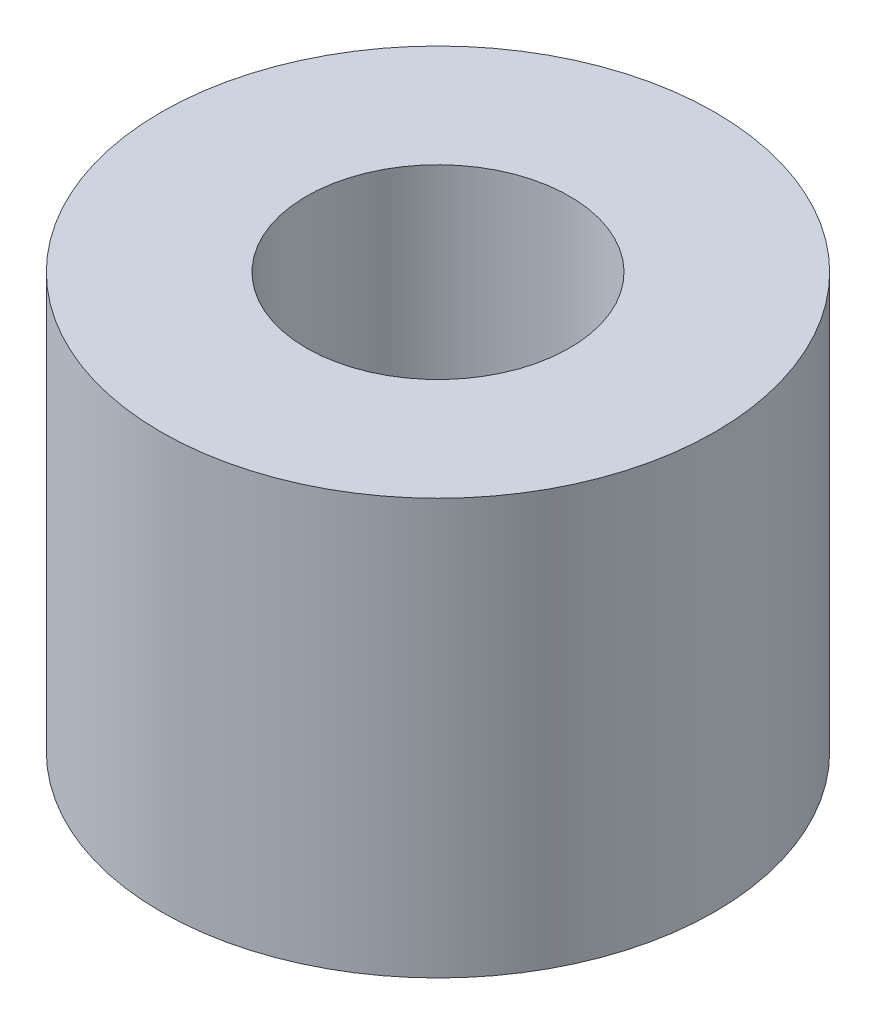
ISO-10303-21;
HEADER;
FILE_DESCRIPTION(('STEP AP214'),'2;1');
FILE_NAME('part.step','',(''),(''),'','','');
FILE_SCHEMA(('AUTOMOTIVE_DESIGN { 1 0 10303 214 1 1 1 1 }'));
ENDSEC;
DATA;
#1=APPLICATION_CONTEXT('core data for automotive mechanical design processes');
#2=APPLICATION_PROTOCOL_DEFINITION('international standard','automotive_design',2000,#1);
#3=PRODUCT_CONTEXT('',#1,'mechanical');
#4=PRODUCT('Part','Part','',(#3));
#5=PRODUCT_RELATED_PRODUCT_CATEGORY('part','',(#4));
#6=PRODUCT_DEFINITION_FORMATION('','',#4);
#7=PRODUCT_DEFINITION_CONTEXT('part definition',#1,'design');
#8=PRODUCT_DEFINITION('design','',#6,#7);
#9=PRODUCT_DEFINITION_SHAPE('','',#8);
#10=(LENGTH_UNIT() NAMED_UNIT(*) SI_UNIT(.MILLI.,.METRE.));
#11=(NAMED_UNIT(*) PLANE_ANGLE_UNIT() SI_UNIT($,.RADIAN.));
#12=(NAMED_UNIT(*) SI_UNIT($,.STERADIAN.) SOLID_ANGLE_UNIT());
#13=UNCERTAINTY_MEASURE_WITH_UNIT(LENGTH_MEASURE(1.E-05),#10,'distance_accuracy_value','');
#14=(GEOMETRIC_REPRESENTATION_CONTEXT(3) GLOBAL_UNCERTAINTY_ASSIGNED_CONTEXT((#13)) GLOBAL_UNIT_ASSIGNED_CONTEXT((#10,
#11,#12)) REPRESENTATION_CONTEXT('',''));
#15=CARTESIAN_POINT('',(0.,0.,0.));
#16=DIRECTION('',(0.,0.,1.));
#17=DIRECTION('',(1.,0.,0.));
#18=AXIS2_PLACEMENT_3D('',#15,#16,#17);
#19=CARTESIAN_POINT('',(0.,3.,0.));
#20=DIRECTION('',(0.,1.,0.));
#21=DIRECTION('',(0.,0.,1.));
#22=AXIS2_PLACEMENT_3D('',#19,#20,#21);
#23=PLANE('',#22);
#24=CARTESIAN_POINT('',(0.,3.,0.));
#25=DIRECTION('',(0.,1.,0.));
#26=DIRECTION('',(0.,0.,1.));
#27=AXIS2_PLACEMENT_3D('',#24,#25,#26);
#28=CIRCLE('',#27,2.);
#29=CARTESIAN_POINT('',(0.,3.,2.));
#30=VERTEX_POINT('',#29);
#31=EDGE_CURVE('E10',#30,#30,#28,.T.);
#32=ORIENTED_EDGE('',*,*,#31,.T.);
#33=EDGE_LOOP('',(#32));
#34=FACE_BOUND('',#33,.T.);
#35=CARTESIAN_POINT('',(0.,3.,0.));
#36=DIRECTION('',(0.,1.,0.));
#37=DIRECTION('',(0.,0.,1.));
#38=AXIS2_PLACEMENT_3D('',#35,#36,#37);
#39=CIRCLE('',#38,0.95);
#40=CARTESIAN_POINT('',(0.,3.,0.95));
#41=VERTEX_POINT('',#40);
#42=EDGE_CURVE('E42',#41,#41,#39,.T.);
#43=ORIENTED_EDGE('',*,*,#42,.F.);
#44=EDGE_LOOP('',(#43));
#45=FACE_BOUND('',#44,.T.);
#46=ADVANCED_FACE('F31',(#34,#45),#23,.T.);
#47=CARTESIAN_POINT('',(0.,0.,0.));
#48=DIRECTION('',(0.,1.,0.));
#49=DIRECTION('',(0.,0.,1.));
#50=AXIS2_PLACEMENT_3D('',#47,#48,#49);
#51=PLANE('',#50);
#52=CARTESIAN_POINT('',(0.,0.,0.));
#53=DIRECTION('',(0.,1.,0.));
#54=DIRECTION('',(0.,0.,1.));
#55=AXIS2_PLACEMENT_3D('',#52,#53,#54);
#56=CIRCLE('',#55,2.);
#57=CARTESIAN_POINT('',(0.,0.,2.));
#58=VERTEX_POINT('',#57);
#59=EDGE_CURVE('E35',#58,#58,#56,.T.);
#60=ORIENTED_EDGE('',*,*,#59,.F.);
#61=EDGE_LOOP('',(#60));
#62=FACE_BOUND('',#61,.T.);
#63=CARTESIAN_POINT('',(0.,0.,0.));
#64=DIRECTION('',(0.,1.,0.));
#65=DIRECTION('',(0.,0.,1.));
#66=AXIS2_PLACEMENT_3D('',#63,#64,#65);
#67=CIRCLE('',#66,0.95);
#68=CARTESIAN_POINT('',(0.,0.,0.95));
#69=VERTEX_POINT('',#68);
#70=EDGE_CURVE('E44',#69,#69,#67,.T.);
#71=ORIENTED_EDGE('',*,*,#70,.T.);
#72=EDGE_LOOP('',(#71));
#73=FACE_BOUND('',#72,.T.);
#74=ADVANCED_FACE('F54',(#62,#73),#51,.F.);
#75=CARTESIAN_POINT('',(0.,3.,0.));
#76=DIRECTION('',(0.,-1.,0.));
#77=DIRECTION('',(0.,0.,-1.));
#78=AXIS2_PLACEMENT_3D('',#75,#76,#77);
#79=CYLINDRICAL_SURFACE('',#78,2.);
#80=ORIENTED_EDGE('',*,*,#31,.F.);
#81=EDGE_LOOP('',(#80));
#82=FACE_BOUND('',#81,.T.);
#83=ORIENTED_EDGE('',*,*,#59,.T.);
#84=EDGE_LOOP('',(#83));
#85=FACE_BOUND('',#84,.T.);
#86=ADVANCED_FACE('F33',(#82,#85),#79,.T.);
#87=CARTESIAN_POINT('',(0.,3.,0.));
#88=DIRECTION('',(0.,-1.,0.));
#89=DIRECTION('',(0.,0.,-1.));
#90=AXIS2_PLACEMENT_3D('',#87,#88,#89);
#91=CYLINDRICAL_SURFACE('',#90,0.95);
#92=ORIENTED_EDGE('',*,*,#42,.T.);
#93=EDGE_LOOP('',(#92));
#94=FACE_BOUND('',#93,.T.);
#95=ORIENTED_EDGE('',*,*,#70,.F.);
#96=EDGE_LOOP('',(#95));
#97=FACE_BOUND('',#96,.T.);
#98=ADVANCED_FACE('F50',(#94,#97),#91,.F.);
#99=CLOSED_SHELL('',(#46,#74,#86,#98));
#100=MANIFOLD_SOLID_BREP('B2',#99);
#101=ADVANCED_BREP_SHAPE_REPRESENTATION('',(#18,#100),#14);
#102=SHAPE_DEFINITION_REPRESENTATION(#9,#101);
ENDSEC;
END-ISO-10303-21;
